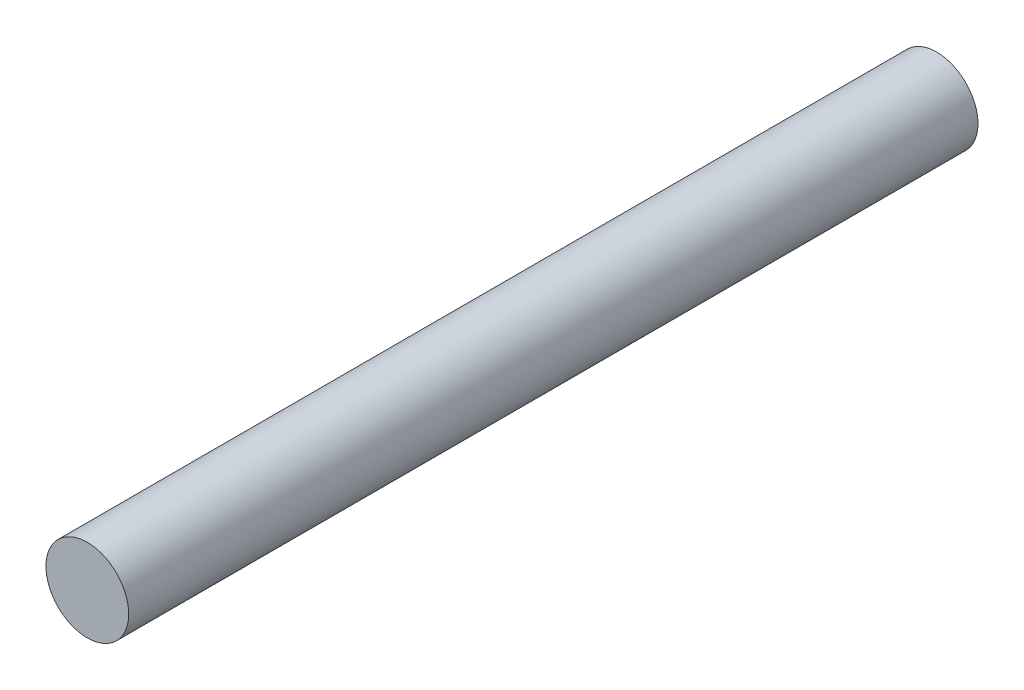
ISO-10303-21;
HEADER;
FILE_DESCRIPTION(('STEP AP214'),'2;1');
FILE_NAME('part.step','',(''),(''),'','','');
FILE_SCHEMA(('AUTOMOTIVE_DESIGN { 1 0 10303 214 1 1 1 1 }'));
ENDSEC;
DATA;
#1=APPLICATION_CONTEXT('core data for automotive mechanical design processes');
#2=APPLICATION_PROTOCOL_DEFINITION('international standard','automotive_design',2000,#1);
#3=PRODUCT_CONTEXT('',#1,'mechanical');
#4=PRODUCT('Part','Part','',(#3));
#5=PRODUCT_RELATED_PRODUCT_CATEGORY('part','',(#4));
#6=PRODUCT_DEFINITION_FORMATION('','',#4);
#7=PRODUCT_DEFINITION_CONTEXT('part definition',#1,'design');
#8=PRODUCT_DEFINITION('design','',#6,#7);
#9=PRODUCT_DEFINITION_SHAPE('','',#8);
#10=(LENGTH_UNIT() NAMED_UNIT(*) SI_UNIT(.MILLI.,.METRE.));
#11=(NAMED_UNIT(*) PLANE_ANGLE_UNIT() SI_UNIT($,.RADIAN.));
#12=(NAMED_UNIT(*) SI_UNIT($,.STERADIAN.) SOLID_ANGLE_UNIT());
#13=UNCERTAINTY_MEASURE_WITH_UNIT(LENGTH_MEASURE(1.E-05),#10,'distance_accuracy_value','');
#14=(GEOMETRIC_REPRESENTATION_CONTEXT(3) GLOBAL_UNCERTAINTY_ASSIGNED_CONTEXT((#13)) GLOBAL_UNIT_ASSIGNED_CONTEXT((#10,
#11,#12)) REPRESENTATION_CONTEXT('',''));
#15=CARTESIAN_POINT('',(0.,0.,0.));
#16=DIRECTION('',(0.,0.,1.));
#17=DIRECTION('',(1.,0.,0.));
#18=AXIS2_PLACEMENT_3D('',#15,#16,#17);
#19=CARTESIAN_POINT('',(0.,0.,15.113));
#20=DIRECTION('',(0.,0.,-1.));
#21=DIRECTION('',(-1.,0.,0.));
#22=AXIS2_PLACEMENT_3D('',#19,#20,#21);
#23=CYLINDRICAL_SURFACE('',#22,0.7366);
#24=CARTESIAN_POINT('',(0.,0.,15.113));
#25=DIRECTION('',(0.,0.,1.));
#26=DIRECTION('',(1.,0.,0.));
#27=AXIS2_PLACEMENT_3D('',#24,#25,#26);
#28=CIRCLE('',#27,0.7366);
#29=CARTESIAN_POINT('',(0.7366,0.,15.113));
#30=VERTEX_POINT('',#29);
#31=EDGE_CURVE('E10',#30,#30,#28,.T.);
#32=ORIENTED_EDGE('',*,*,#31,.F.);
#33=EDGE_LOOP('',(#32));
#34=FACE_BOUND('',#33,.T.);
#35=CARTESIAN_POINT('',(0.,0.,0.));
#36=DIRECTION('',(0.,0.,1.));
#37=DIRECTION('',(1.,0.,0.));
#38=AXIS2_PLACEMENT_3D('',#35,#36,#37);
#39=CIRCLE('',#38,0.7366);
#40=CARTESIAN_POINT('',(0.7366,0.,0.));
#41=VERTEX_POINT('',#40);
#42=EDGE_CURVE('E42',#41,#41,#39,.T.);
#43=ORIENTED_EDGE('',*,*,#42,.T.);
#44=EDGE_LOOP('',(#43));
#45=FACE_BOUND('',#44,.T.);
#46=ADVANCED_FACE('F39',(#34,#45),#23,.T.);
#47=CARTESIAN_POINT('',(0.,0.,15.113));
#48=DIRECTION('',(0.,0.,1.));
#49=DIRECTION('',(1.,0.,0.));
#50=AXIS2_PLACEMENT_3D('',#47,#48,#49);
#51=PLANE('',#50);
#52=ORIENTED_EDGE('',*,*,#31,.T.);
#53=EDGE_LOOP('',(#52));
#54=FACE_BOUND('',#53,.T.);
#55=ADVANCED_FACE('F55',(#54),#51,.T.);
#56=CARTESIAN_POINT('',(0.,0.,0.));
#57=DIRECTION('',(0.,0.,1.));
#58=DIRECTION('',(1.,0.,0.));
#59=AXIS2_PLACEMENT_3D('',#56,#57,#58);
#60=PLANE('',#59);
#61=ORIENTED_EDGE('',*,*,#42,.F.);
#62=EDGE_LOOP('',(#61));
#63=FACE_BOUND('',#62,.T.);
#64=ADVANCED_FACE('F53',(#63),#60,.F.);
#65=CLOSED_SHELL('',(#46,#55,#64));
#66=MANIFOLD_SOLID_BREP('B2',#65);
#67=ADVANCED_BREP_SHAPE_REPRESENTATION('',(#18,#66),#14);
#68=SHAPE_DEFINITION_REPRESENTATION(#9,#67);
ENDSEC;
END-ISO-10303-21;
